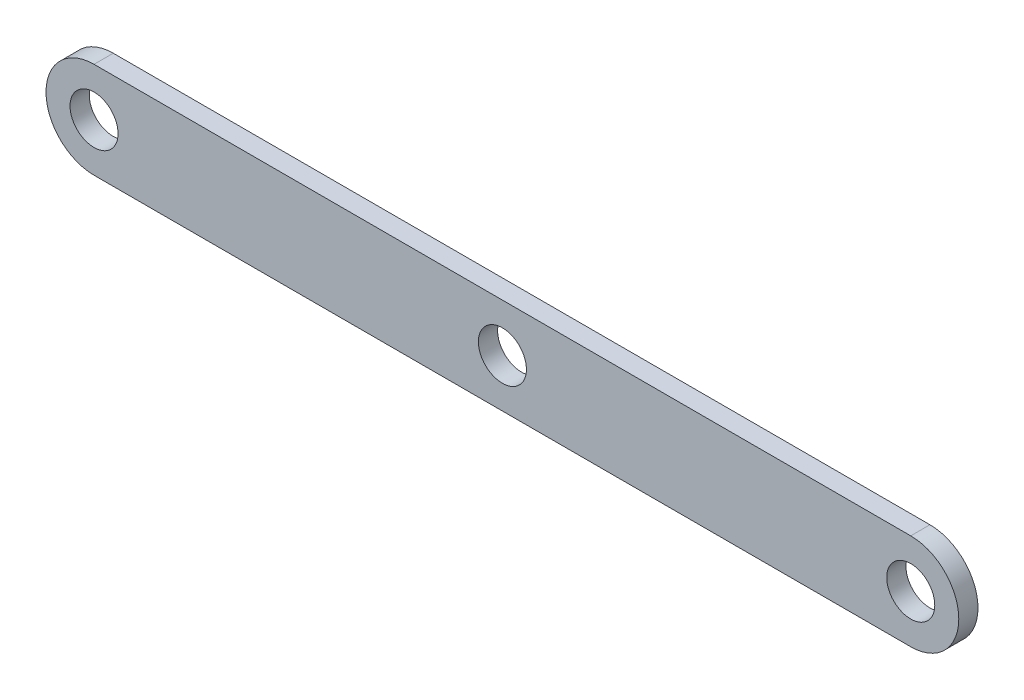
ISO-10303-21;
HEADER;
FILE_DESCRIPTION(('STEP AP214'),'2;1');
FILE_NAME('part.step','',(''),(''),'','','');
FILE_SCHEMA(('AUTOMOTIVE_DESIGN { 1 0 10303 214 1 1 1 1 }'));
ENDSEC;
DATA;
#1=APPLICATION_CONTEXT('core data for automotive mechanical design processes');
#2=APPLICATION_PROTOCOL_DEFINITION('international standard','automotive_design',2000,#1);
#3=PRODUCT_CONTEXT('',#1,'mechanical');
#4=PRODUCT('Part','Part','',(#3));
#5=PRODUCT_RELATED_PRODUCT_CATEGORY('part','',(#4));
#6=PRODUCT_DEFINITION_FORMATION('','',#4);
#7=PRODUCT_DEFINITION_CONTEXT('part definition',#1,'design');
#8=PRODUCT_DEFINITION('design','',#6,#7);
#9=PRODUCT_DEFINITION_SHAPE('','',#8);
#10=(LENGTH_UNIT() NAMED_UNIT(*) SI_UNIT(.MILLI.,.METRE.));
#11=(NAMED_UNIT(*) PLANE_ANGLE_UNIT() SI_UNIT($,.RADIAN.));
#12=(NAMED_UNIT(*) SI_UNIT($,.STERADIAN.) SOLID_ANGLE_UNIT());
#13=UNCERTAINTY_MEASURE_WITH_UNIT(LENGTH_MEASURE(1.E-05),#10,'distance_accuracy_value','');
#14=(GEOMETRIC_REPRESENTATION_CONTEXT(3) GLOBAL_UNCERTAINTY_ASSIGNED_CONTEXT((#13)) GLOBAL_UNIT_ASSIGNED_CONTEXT((#10,
#11,#12)) REPRESENTATION_CONTEXT('',''));
#15=CARTESIAN_POINT('',(0.,0.,0.));
#16=DIRECTION('',(0.,0.,1.));
#17=DIRECTION('',(1.,0.,0.));
#18=AXIS2_PLACEMENT_3D('',#15,#16,#17);
#19=CARTESIAN_POINT('',(42.5,0.,2.));
#20=DIRECTION('',(0.,0.,1.));
#21=DIRECTION('',(1.,0.,0.));
#22=AXIS2_PLACEMENT_3D('',#19,#20,#21);
#23=PLANE('',#22);
#24=CARTESIAN_POINT('',(42.5,0.,2.));
#25=DIRECTION('',(0.,0.,1.));
#26=DIRECTION('',(1.,0.,0.));
#27=AXIS2_PLACEMENT_3D('',#24,#25,#26);
#28=CIRCLE('',#27,2.5);
#29=CARTESIAN_POINT('',(45.,0.,2.));
#30=VERTEX_POINT('',#29);
#31=EDGE_CURVE('E117',#30,#30,#28,.T.);
#32=ORIENTED_EDGE('',*,*,#31,.F.);
#33=EDGE_LOOP('',(#32));
#34=FACE_BOUND('',#33,.T.);
#35=CARTESIAN_POINT('',(42.5,0.,2.));
#36=DIRECTION('',(0.,0.,1.));
#37=DIRECTION('',(1.,0.,0.));
#38=AXIS2_PLACEMENT_3D('',#35,#36,#37);
#39=CIRCLE('',#38,5.);
#40=CARTESIAN_POINT('',(42.5,-5.,2.));
#41=VERTEX_POINT('',#40);
#42=CARTESIAN_POINT('',(42.5,5.,2.));
#43=VERTEX_POINT('',#42);
#44=EDGE_CURVE('E87',#41,#43,#39,.T.);
#45=ORIENTED_EDGE('',*,*,#44,.T.);
#46=DIRECTION('',(-1.,0.,0.));
#47=VECTOR('',#46,1.);
#48=CARTESIAN_POINT('',(-42.5,5.,2.));
#49=LINE('',#48,#47);
#50=CARTESIAN_POINT('',(-42.5,5.,2.));
#51=VERTEX_POINT('',#50);
#52=EDGE_CURVE('E82',#43,#51,#49,.T.);
#53=ORIENTED_EDGE('',*,*,#52,.T.);
#54=CARTESIAN_POINT('',(-42.5,0.,2.));
#55=DIRECTION('',(0.,0.,1.));
#56=DIRECTION('',(1.,0.,0.));
#57=AXIS2_PLACEMENT_3D('',#54,#55,#56);
#58=CIRCLE('',#57,5.);
#59=CARTESIAN_POINT('',(-42.5,-5.,2.));
#60=VERTEX_POINT('',#59);
#61=EDGE_CURVE('E85',#51,#60,#58,.T.);
#62=ORIENTED_EDGE('',*,*,#61,.T.);
#63=DIRECTION('',(1.,0.,0.));
#64=VECTOR('',#63,1.);
#65=CARTESIAN_POINT('',(-42.5,-5.00000000000001,2.));
#66=LINE('',#65,#64);
#67=EDGE_CURVE('E52',#60,#41,#66,.T.);
#68=ORIENTED_EDGE('',*,*,#67,.T.);
#69=EDGE_LOOP('',(#45,#53,#62,#68));
#70=FACE_BOUND('',#69,.T.);
#71=CARTESIAN_POINT('',(-42.5,0.,2.));
#72=DIRECTION('',(0.,0.,1.));
#73=DIRECTION('',(1.,0.,0.));
#74=AXIS2_PLACEMENT_3D('',#71,#72,#73);
#75=CIRCLE('',#74,2.5);
#76=CARTESIAN_POINT('',(-40.,0.,2.));
#77=VERTEX_POINT('',#76);
#78=EDGE_CURVE('E102',#77,#77,#75,.T.);
#79=ORIENTED_EDGE('',*,*,#78,.F.);
#80=EDGE_LOOP('',(#79));
#81=FACE_BOUND('',#80,.T.);
#82=CARTESIAN_POINT('',(0.,0.,2.));
#83=DIRECTION('',(0.,0.,1.));
#84=DIRECTION('',(1.,0.,0.));
#85=AXIS2_PLACEMENT_3D('',#82,#83,#84);
#86=CIRCLE('',#85,2.5);
#87=CARTESIAN_POINT('',(2.50000000000002,0.,2.));
#88=VERTEX_POINT('',#87);
#89=EDGE_CURVE('E123',#88,#88,#86,.T.);
#90=ORIENTED_EDGE('',*,*,#89,.F.);
#91=EDGE_LOOP('',(#90));
#92=FACE_BOUND('',#91,.T.);
#93=ADVANCED_FACE('F35',(#34,#70,#81,#92),#23,.T.);
#94=CARTESIAN_POINT('',(42.5,0.,0.));
#95=DIRECTION('',(0.,0.,1.));
#96=DIRECTION('',(1.,0.,0.));
#97=AXIS2_PLACEMENT_3D('',#94,#95,#96);
#98=PLANE('',#97);
#99=CARTESIAN_POINT('',(42.5,0.,0.));
#100=DIRECTION('',(0.,0.,1.));
#101=DIRECTION('',(1.,0.,0.));
#102=AXIS2_PLACEMENT_3D('',#99,#100,#101);
#103=CIRCLE('',#102,2.5);
#104=CARTESIAN_POINT('',(45.,0.,0.));
#105=VERTEX_POINT('',#104);
#106=EDGE_CURVE('E120',#105,#105,#103,.T.);
#107=ORIENTED_EDGE('',*,*,#106,.T.);
#108=EDGE_LOOP('',(#107));
#109=FACE_BOUND('',#108,.T.);
#110=CARTESIAN_POINT('',(42.5,0.,0.));
#111=DIRECTION('',(0.,0.,1.));
#112=DIRECTION('',(1.,0.,0.));
#113=AXIS2_PLACEMENT_3D('',#110,#111,#112);
#114=CIRCLE('',#113,5.);
#115=CARTESIAN_POINT('',(42.5,-5.,0.));
#116=VERTEX_POINT('',#115);
#117=CARTESIAN_POINT('',(42.5,5.,0.));
#118=VERTEX_POINT('',#117);
#119=EDGE_CURVE('E99',#116,#118,#114,.T.);
#120=ORIENTED_EDGE('',*,*,#119,.F.);
#121=DIRECTION('',(1.,0.,0.));
#122=VECTOR('',#121,1.);
#123=CARTESIAN_POINT('',(-42.5,-5.00000000000001,0.));
#124=LINE('',#123,#122);
#125=CARTESIAN_POINT('',(-42.5,-5.,0.));
#126=VERTEX_POINT('',#125);
#127=EDGE_CURVE('E75',#126,#116,#124,.T.);
#128=ORIENTED_EDGE('',*,*,#127,.F.);
#129=CARTESIAN_POINT('',(-42.5,0.,0.));
#130=DIRECTION('',(0.,0.,1.));
#131=DIRECTION('',(1.,0.,0.));
#132=AXIS2_PLACEMENT_3D('',#129,#130,#131);
#133=CIRCLE('',#132,5.);
#134=CARTESIAN_POINT('',(-42.5,5.,0.));
#135=VERTEX_POINT('',#134);
#136=EDGE_CURVE('E69',#135,#126,#133,.T.);
#137=ORIENTED_EDGE('',*,*,#136,.F.);
#138=DIRECTION('',(-1.,0.,0.));
#139=VECTOR('',#138,1.);
#140=CARTESIAN_POINT('',(-42.5,5.,0.));
#141=LINE('',#140,#139);
#142=EDGE_CURVE('E91',#118,#135,#141,.T.);
#143=ORIENTED_EDGE('',*,*,#142,.F.);
#144=EDGE_LOOP('',(#120,#128,#137,#143));
#145=FACE_BOUND('',#144,.T.);
#146=CARTESIAN_POINT('',(-42.5,0.,0.));
#147=DIRECTION('',(0.,0.,1.));
#148=DIRECTION('',(1.,0.,0.));
#149=AXIS2_PLACEMENT_3D('',#146,#147,#148);
#150=CIRCLE('',#149,2.5);
#151=CARTESIAN_POINT('',(-40.,0.,0.));
#152=VERTEX_POINT('',#151);
#153=EDGE_CURVE('E114',#152,#152,#150,.T.);
#154=ORIENTED_EDGE('',*,*,#153,.T.);
#155=EDGE_LOOP('',(#154));
#156=FACE_BOUND('',#155,.T.);
#157=CARTESIAN_POINT('',(0.,0.,0.));
#158=DIRECTION('',(0.,0.,1.));
#159=DIRECTION('',(1.,0.,0.));
#160=AXIS2_PLACEMENT_3D('',#157,#158,#159);
#161=CIRCLE('',#160,2.5);
#162=CARTESIAN_POINT('',(2.50000000000002,0.,0.));
#163=VERTEX_POINT('',#162);
#164=EDGE_CURVE('E126',#163,#163,#161,.T.);
#165=ORIENTED_EDGE('',*,*,#164,.T.);
#166=EDGE_LOOP('',(#165));
#167=FACE_BOUND('',#166,.T.);
#168=ADVANCED_FACE('F110',(#109,#145,#156,#167),#98,.F.);
#169=CARTESIAN_POINT('',(42.5,0.,2.));
#170=DIRECTION('',(0.,0.,-1.));
#171=DIRECTION('',(-1.,0.,0.));
#172=AXIS2_PLACEMENT_3D('',#169,#170,#171);
#173=CYLINDRICAL_SURFACE('',#172,5.);
#174=ORIENTED_EDGE('',*,*,#119,.T.);
#175=DIRECTION('',(0.,0.,-1.));
#176=VECTOR('',#175,1.);
#177=CARTESIAN_POINT('',(42.5,5.,2.));
#178=LINE('',#177,#176);
#179=EDGE_CURVE('E11',#43,#118,#178,.T.);
#180=ORIENTED_EDGE('',*,*,#179,.F.);
#181=ORIENTED_EDGE('',*,*,#44,.F.);
#182=DIRECTION('',(0.,0.,-1.));
#183=VECTOR('',#182,1.);
#184=CARTESIAN_POINT('',(42.5,-5.,2.));
#185=LINE('',#184,#183);
#186=EDGE_CURVE('E95',#41,#116,#185,.T.);
#187=ORIENTED_EDGE('',*,*,#186,.T.);
#188=EDGE_LOOP('',(#174,#180,#181,#187));
#189=FACE_BOUND('',#188,.T.);
#190=ADVANCED_FACE('F37',(#189),#173,.T.);
#191=CARTESIAN_POINT('',(-42.5,5.,2.));
#192=DIRECTION('',(0.,-1.,0.));
#193=DIRECTION('',(0.,0.,-1.));
#194=AXIS2_PLACEMENT_3D('',#191,#192,#193);
#195=PLANE('',#194);
#196=ORIENTED_EDGE('',*,*,#142,.T.);
#197=DIRECTION('',(0.,0.,-1.));
#198=VECTOR('',#197,1.);
#199=CARTESIAN_POINT('',(-42.5,5.,2.));
#200=LINE('',#199,#198);
#201=EDGE_CURVE('E44',#51,#135,#200,.T.);
#202=ORIENTED_EDGE('',*,*,#201,.F.);
#203=ORIENTED_EDGE('',*,*,#52,.F.);
#204=ORIENTED_EDGE('',*,*,#179,.T.);
#205=EDGE_LOOP('',(#196,#202,#203,#204));
#206=FACE_BOUND('',#205,.T.);
#207=ADVANCED_FACE('F90',(#206),#195,.F.);
#208=CARTESIAN_POINT('',(-42.5,0.,2.));
#209=DIRECTION('',(0.,0.,-1.));
#210=DIRECTION('',(-1.,0.,0.));
#211=AXIS2_PLACEMENT_3D('',#208,#209,#210);
#212=CYLINDRICAL_SURFACE('',#211,5.);
#213=ORIENTED_EDGE('',*,*,#136,.T.);
#214=DIRECTION('',(0.,0.,-1.));
#215=VECTOR('',#214,1.);
#216=CARTESIAN_POINT('',(-42.5,-5.,2.));
#217=LINE('',#216,#215);
#218=EDGE_CURVE('E92',#60,#126,#217,.T.);
#219=ORIENTED_EDGE('',*,*,#218,.F.);
#220=ORIENTED_EDGE('',*,*,#61,.F.);
#221=ORIENTED_EDGE('',*,*,#201,.T.);
#222=EDGE_LOOP('',(#213,#219,#220,#221));
#223=FACE_BOUND('',#222,.T.);
#224=ADVANCED_FACE('F93',(#223),#212,.T.);
#225=CARTESIAN_POINT('',(-42.5,-5.00000000000001,2.));
#226=DIRECTION('',(0.,1.,0.));
#227=DIRECTION('',(-1.,0.,0.));
#228=AXIS2_PLACEMENT_3D('',#225,#226,#227);
#229=PLANE('',#228);
#230=ORIENTED_EDGE('',*,*,#127,.T.);
#231=ORIENTED_EDGE('',*,*,#186,.F.);
#232=ORIENTED_EDGE('',*,*,#67,.F.);
#233=ORIENTED_EDGE('',*,*,#218,.T.);
#234=EDGE_LOOP('',(#230,#231,#232,#233));
#235=FACE_BOUND('',#234,.T.);
#236=ADVANCED_FACE('F107',(#235),#229,.F.);
#237=CARTESIAN_POINT('',(-42.5,0.,2.));
#238=DIRECTION('',(0.,0.,-1.));
#239=DIRECTION('',(-1.,0.,0.));
#240=AXIS2_PLACEMENT_3D('',#237,#238,#239);
#241=CYLINDRICAL_SURFACE('',#240,2.5);
#242=ORIENTED_EDGE('',*,*,#78,.T.);
#243=EDGE_LOOP('',(#242));
#244=FACE_BOUND('',#243,.T.);
#245=ORIENTED_EDGE('',*,*,#153,.F.);
#246=EDGE_LOOP('',(#245));
#247=FACE_BOUND('',#246,.T.);
#248=ADVANCED_FACE('F145',(#244,#247),#241,.F.);
#249=CARTESIAN_POINT('',(42.5,0.,2.));
#250=DIRECTION('',(0.,0.,-1.));
#251=DIRECTION('',(-1.,0.,0.));
#252=AXIS2_PLACEMENT_3D('',#249,#250,#251);
#253=CYLINDRICAL_SURFACE('',#252,2.5);
#254=ORIENTED_EDGE('',*,*,#31,.T.);
#255=EDGE_LOOP('',(#254));
#256=FACE_BOUND('',#255,.T.);
#257=ORIENTED_EDGE('',*,*,#106,.F.);
#258=EDGE_LOOP('',(#257));
#259=FACE_BOUND('',#258,.T.);
#260=ADVANCED_FACE('F191',(#256,#259),#253,.F.);
#261=CARTESIAN_POINT('',(0.,0.,2.));
#262=DIRECTION('',(0.,0.,-1.));
#263=DIRECTION('',(-1.,0.,0.));
#264=AXIS2_PLACEMENT_3D('',#261,#262,#263);
#265=CYLINDRICAL_SURFACE('',#264,2.5);
#266=ORIENTED_EDGE('',*,*,#89,.T.);
#267=EDGE_LOOP('',(#266));
#268=FACE_BOUND('',#267,.T.);
#269=ORIENTED_EDGE('',*,*,#164,.F.);
#270=EDGE_LOOP('',(#269));
#271=FACE_BOUND('',#270,.T.);
#272=ADVANCED_FACE('F132',(#268,#271),#265,.F.);
#273=CLOSED_SHELL('',(#93,#168,#190,#207,#224,#236,#248,#260,#272));
#274=MANIFOLD_SOLID_BREP('B2',#273);
#275=ADVANCED_BREP_SHAPE_REPRESENTATION('',(#18,#274),#14);
#276=SHAPE_DEFINITION_REPRESENTATION(#9,#275);
ENDSEC;
END-ISO-10303-21;
